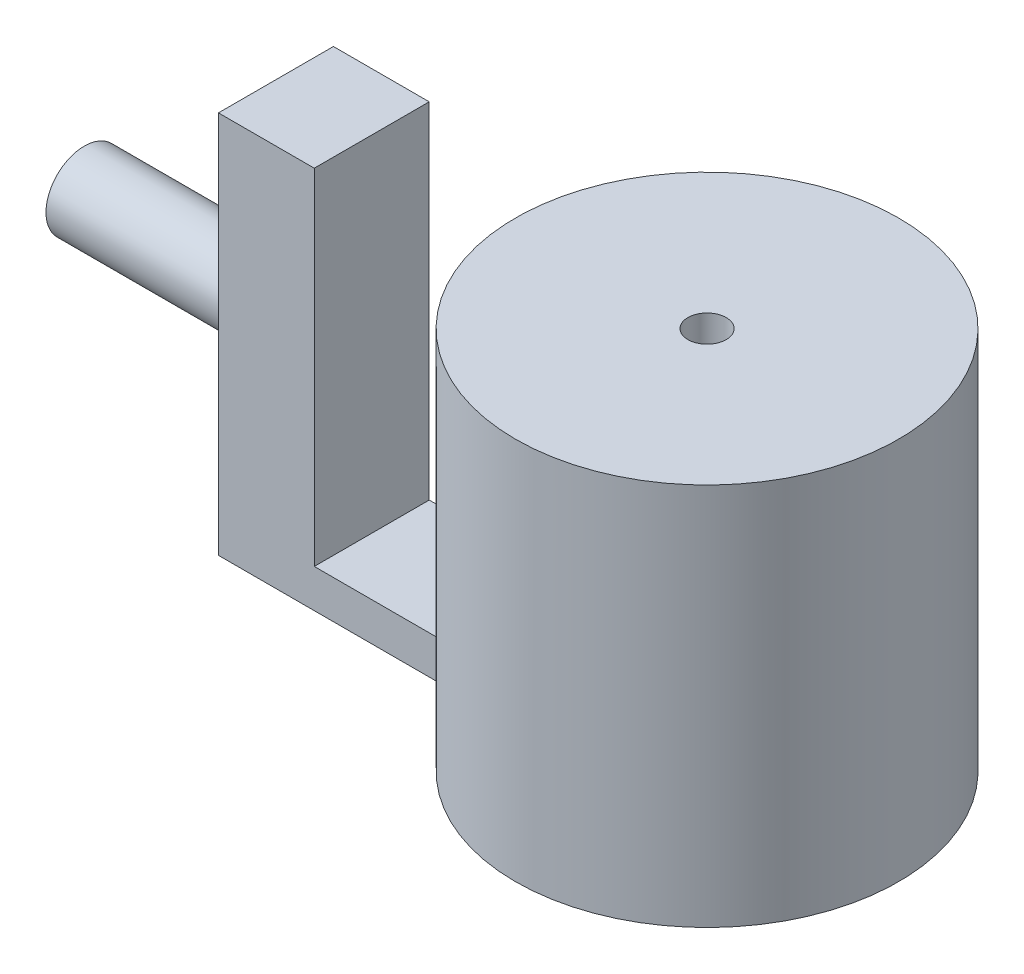
ISO-10303-21;
HEADER;
FILE_DESCRIPTION(('STEP AP214'),'2;1');
FILE_NAME('part.step','',(''),(''),'','','');
FILE_SCHEMA(('AUTOMOTIVE_DESIGN { 1 0 10303 214 1 1 1 1 }'));
ENDSEC;
DATA;
#1=APPLICATION_CONTEXT('core data for automotive mechanical design processes');
#2=APPLICATION_PROTOCOL_DEFINITION('international standard','automotive_design',2000,#1);
#3=PRODUCT_CONTEXT('',#1,'mechanical');
#4=PRODUCT('Part','Part','',(#3));
#5=PRODUCT_RELATED_PRODUCT_CATEGORY('part','',(#4));
#6=PRODUCT_DEFINITION_FORMATION('','',#4);
#7=PRODUCT_DEFINITION_CONTEXT('part definition',#1,'design');
#8=PRODUCT_DEFINITION('design','',#6,#7);
#9=PRODUCT_DEFINITION_SHAPE('','',#8);
#10=(LENGTH_UNIT() NAMED_UNIT(*) SI_UNIT(.MILLI.,.METRE.));
#11=(NAMED_UNIT(*) PLANE_ANGLE_UNIT() SI_UNIT($,.RADIAN.));
#12=(NAMED_UNIT(*) SI_UNIT($,.STERADIAN.) SOLID_ANGLE_UNIT());
#13=UNCERTAINTY_MEASURE_WITH_UNIT(LENGTH_MEASURE(1.E-05),#10,'distance_accuracy_value','');
#14=(GEOMETRIC_REPRESENTATION_CONTEXT(3) GLOBAL_UNCERTAINTY_ASSIGNED_CONTEXT((#13)) GLOBAL_UNIT_ASSIGNED_CONTEXT((#10,
#11,#12)) REPRESENTATION_CONTEXT('',''));
#15=CARTESIAN_POINT('',(0.,0.,0.));
#16=DIRECTION('',(0.,0.,1.));
#17=DIRECTION('',(1.,0.,0.));
#18=AXIS2_PLACEMENT_3D('',#15,#16,#17);
#19=CARTESIAN_POINT('',(0.,100.,0.));
#20=DIRECTION('',(0.,1.,0.));
#21=DIRECTION('',(0.,0.,1.));
#22=AXIS2_PLACEMENT_3D('',#19,#20,#21);
#23=PLANE('',#22);
#24=CARTESIAN_POINT('',(0.,100.,0.));
#25=DIRECTION('',(0.,1.,0.));
#26=DIRECTION('',(0.,0.,1.));
#27=AXIS2_PLACEMENT_3D('',#24,#25,#26);
#28=CIRCLE('',#27,50.);
#29=CARTESIAN_POINT('',(0.,100.,50.));
#30=VERTEX_POINT('',#29);
#31=EDGE_CURVE('E178',#30,#30,#28,.T.);
#32=ORIENTED_EDGE('',*,*,#31,.T.);
#33=EDGE_LOOP('',(#32));
#34=FACE_BOUND('',#33,.T.);
#35=CARTESIAN_POINT('',(0.,100.,0.));
#36=DIRECTION('',(0.,1.,0.));
#37=DIRECTION('',(0.,0.,1.));
#38=AXIS2_PLACEMENT_3D('',#35,#36,#37);
#39=CIRCLE('',#38,5.);
#40=CARTESIAN_POINT('',(0.,100.,5.));
#41=VERTEX_POINT('',#40);
#42=EDGE_CURVE('E170',#41,#41,#39,.T.);
#43=ORIENTED_EDGE('',*,*,#42,.F.);
#44=EDGE_LOOP('',(#43));
#45=FACE_BOUND('',#44,.T.);
#46=ADVANCED_FACE('F45',(#34,#45),#23,.T.);
#47=CARTESIAN_POINT('',(0.,0.,0.));
#48=DIRECTION('',(0.,1.,0.));
#49=DIRECTION('',(0.,0.,1.));
#50=AXIS2_PLACEMENT_3D('',#47,#48,#49);
#51=PLANE('',#50);
#52=DIRECTION('',(-1.,0.,0.));
#53=VECTOR('',#52,1.);
#54=CARTESIAN_POINT('',(-47.6969600708473,0.,15.));
#55=LINE('',#54,#53);
#56=CARTESIAN_POINT('',(-47.6969600708473,0.,15.));
#57=VERTEX_POINT('',#56);
#58=CARTESIAN_POINT('',(-112.5,0.,15.));
#59=VERTEX_POINT('',#58);
#60=EDGE_CURVE('E152',#57,#59,#55,.T.);
#61=ORIENTED_EDGE('',*,*,#60,.T.);
#62=DIRECTION('',(0.,0.,-1.));
#63=VECTOR('',#62,1.);
#64=CARTESIAN_POINT('',(-112.5,0.,15.));
#65=LINE('',#64,#63);
#66=CARTESIAN_POINT('',(-112.5,0.,-15.));
#67=VERTEX_POINT('',#66);
#68=EDGE_CURVE('E120',#59,#67,#65,.T.);
#69=ORIENTED_EDGE('',*,*,#68,.T.);
#70=DIRECTION('',(1.,0.,0.));
#71=VECTOR('',#70,1.);
#72=CARTESIAN_POINT('',(-47.6969600708473,0.,-15.));
#73=LINE('',#72,#71);
#74=CARTESIAN_POINT('',(-47.6969600708473,0.,-15.));
#75=VERTEX_POINT('',#74);
#76=EDGE_CURVE('E148',#67,#75,#73,.T.);
#77=ORIENTED_EDGE('',*,*,#76,.T.);
#78=CARTESIAN_POINT('',(0.,0.,0.));
#79=DIRECTION('',(0.,1.,0.));
#80=DIRECTION('',(0.,0.,1.));
#81=AXIS2_PLACEMENT_3D('',#78,#79,#80);
#82=CIRCLE('',#81,50.);
#83=EDGE_CURVE('E174',#57,#75,#82,.T.);
#84=ORIENTED_EDGE('',*,*,#83,.F.);
#85=EDGE_LOOP('',(#61,#69,#77,#84));
#86=FACE_BOUND('',#85,.T.);
#87=CARTESIAN_POINT('',(0.,0.,0.));
#88=DIRECTION('',(0.,1.,0.));
#89=DIRECTION('',(0.,0.,1.));
#90=AXIS2_PLACEMENT_3D('',#87,#88,#89);
#91=CIRCLE('',#90,5.);
#92=CARTESIAN_POINT('',(0.,0.,5.));
#93=VERTEX_POINT('',#92);
#94=EDGE_CURVE('E166',#93,#93,#91,.T.);
#95=ORIENTED_EDGE('',*,*,#94,.T.);
#96=EDGE_LOOP('',(#95));
#97=FACE_BOUND('',#96,.T.);
#98=ADVANCED_FACE('F191',(#86,#97),#51,.F.);
#99=CARTESIAN_POINT('',(0.,100.,0.));
#100=DIRECTION('',(0.,-1.,0.));
#101=DIRECTION('',(0.,0.,-1.));
#102=AXIS2_PLACEMENT_3D('',#99,#100,#101);
#103=CYLINDRICAL_SURFACE('',#102,50.);
#104=ORIENTED_EDGE('',*,*,#31,.F.);
#105=EDGE_LOOP('',(#104));
#106=FACE_BOUND('',#105,.T.);
#107=CARTESIAN_POINT('',(0.,10.,0.));
#108=DIRECTION('',(0.,1.,0.));
#109=DIRECTION('',(0.,0.,1.));
#110=AXIS2_PLACEMENT_3D('',#107,#108,#109);
#111=CIRCLE('',#110,50.);
#112=CARTESIAN_POINT('',(-47.6969600708473,9.99999999999999,-15.));
#113=VERTEX_POINT('',#112);
#114=CARTESIAN_POINT('',(-47.6969600708473,9.99999999999999,15.));
#115=VERTEX_POINT('',#114);
#116=EDGE_CURVE('E69',#113,#115,#111,.T.);
#117=ORIENTED_EDGE('',*,*,#116,.T.);
#118=DIRECTION('',(0.,-1.,0.));
#119=VECTOR('',#118,1.);
#120=CARTESIAN_POINT('',(-47.6969600708473,10.,15.));
#121=LINE('',#120,#119);
#122=EDGE_CURVE('E163',#115,#57,#121,.T.);
#123=ORIENTED_EDGE('',*,*,#122,.T.);
#124=ORIENTED_EDGE('',*,*,#83,.T.);
#125=DIRECTION('',(0.,-1.,0.));
#126=VECTOR('',#125,1.);
#127=CARTESIAN_POINT('',(-47.6969600708473,10.,-15.));
#128=LINE('',#127,#126);
#129=EDGE_CURVE('E158',#113,#75,#128,.T.);
#130=ORIENTED_EDGE('',*,*,#129,.F.);
#131=EDGE_LOOP('',(#117,#123,#124,#130));
#132=FACE_BOUND('',#131,.T.);
#133=ADVANCED_FACE('F47',(#106,#132),#103,.T.);
#134=CARTESIAN_POINT('',(0.,100.,0.));
#135=DIRECTION('',(0.,-1.,0.));
#136=DIRECTION('',(0.,0.,-1.));
#137=AXIS2_PLACEMENT_3D('',#134,#135,#136);
#138=CYLINDRICAL_SURFACE('',#137,5.);
#139=ORIENTED_EDGE('',*,*,#42,.T.);
#140=EDGE_LOOP('',(#139));
#141=FACE_BOUND('',#140,.T.);
#142=ORIENTED_EDGE('',*,*,#94,.F.);
#143=EDGE_LOOP('',(#142));
#144=FACE_BOUND('',#143,.T.);
#145=ADVANCED_FACE('F196',(#141,#144),#138,.F.);
#146=CARTESIAN_POINT('',(-47.6969600708473,10.,15.));
#147=DIRECTION('',(0.,0.,1.));
#148=DIRECTION('',(1.,0.,0.));
#149=AXIS2_PLACEMENT_3D('',#146,#147,#148);
#150=PLANE('',#149);
#151=DIRECTION('',(0.,-1.,0.));
#152=VECTOR('',#151,1.);
#153=CARTESIAN_POINT('',(-112.5,139.051248379533,15.));
#154=LINE('',#153,#152);
#155=CARTESIAN_POINT('',(-112.5,100.,15.));
#156=VERTEX_POINT('',#155);
#157=EDGE_CURVE('E114',#156,#59,#154,.T.);
#158=ORIENTED_EDGE('',*,*,#157,.T.);
#159=ORIENTED_EDGE('',*,*,#60,.F.);
#160=ORIENTED_EDGE('',*,*,#122,.F.);
#161=DIRECTION('',(-1.,0.,0.));
#162=VECTOR('',#161,1.);
#163=CARTESIAN_POINT('',(-47.6969600708473,10.,15.));
#164=LINE('',#163,#162);
#165=CARTESIAN_POINT('',(-87.5,10.,15.));
#166=VERTEX_POINT('',#165);
#167=EDGE_CURVE('E155',#115,#166,#164,.T.);
#168=ORIENTED_EDGE('',*,*,#167,.T.);
#169=DIRECTION('',(0.,-1.,0.));
#170=VECTOR('',#169,1.);
#171=CARTESIAN_POINT('',(-87.5,139.051248379533,15.));
#172=LINE('',#171,#170);
#173=CARTESIAN_POINT('',(-87.5,100.,15.));
#174=VERTEX_POINT('',#173);
#175=EDGE_CURVE('E128',#174,#166,#172,.T.);
#176=ORIENTED_EDGE('',*,*,#175,.F.);
#177=DIRECTION('',(-1.,0.,0.));
#178=VECTOR('',#177,1.);
#179=CARTESIAN_POINT('',(-112.5,100.,15.));
#180=LINE('',#179,#178);
#181=EDGE_CURVE('E105',#174,#156,#180,.T.);
#182=ORIENTED_EDGE('',*,*,#181,.T.);
#183=EDGE_LOOP('',(#158,#159,#160,#168,#176,#182));
#184=FACE_BOUND('',#183,.T.);
#185=ADVANCED_FACE('F126',(#184),#150,.T.);
#186=CARTESIAN_POINT('',(-47.6969600708473,10.,-15.));
#187=DIRECTION('',(0.,0.,-1.));
#188=DIRECTION('',(-1.,0.,0.));
#189=AXIS2_PLACEMENT_3D('',#186,#187,#188);
#190=PLANE('',#189);
#191=ORIENTED_EDGE('',*,*,#76,.F.);
#192=DIRECTION('',(0.,-1.,0.));
#193=VECTOR('',#192,1.);
#194=CARTESIAN_POINT('',(-112.5,139.051248379533,-15.));
#195=LINE('',#194,#193);
#196=CARTESIAN_POINT('',(-112.5,100.,-15.));
#197=VERTEX_POINT('',#196);
#198=EDGE_CURVE('E113',#197,#67,#195,.T.);
#199=ORIENTED_EDGE('',*,*,#198,.F.);
#200=DIRECTION('',(1.,0.,0.));
#201=VECTOR('',#200,1.);
#202=CARTESIAN_POINT('',(-112.5,100.,-15.));
#203=LINE('',#202,#201);
#204=CARTESIAN_POINT('',(-87.5,100.,-15.));
#205=VERTEX_POINT('',#204);
#206=EDGE_CURVE('E108',#197,#205,#203,.T.);
#207=ORIENTED_EDGE('',*,*,#206,.T.);
#208=DIRECTION('',(0.,-1.,0.));
#209=VECTOR('',#208,1.);
#210=CARTESIAN_POINT('',(-87.5,139.051248379533,-15.));
#211=LINE('',#210,#209);
#212=CARTESIAN_POINT('',(-87.5,10.,-15.));
#213=VERTEX_POINT('',#212);
#214=EDGE_CURVE('E138',#205,#213,#211,.T.);
#215=ORIENTED_EDGE('',*,*,#214,.T.);
#216=DIRECTION('',(1.,0.,0.));
#217=VECTOR('',#216,1.);
#218=CARTESIAN_POINT('',(-47.6969600708473,10.,-15.));
#219=LINE('',#218,#217);
#220=EDGE_CURVE('E149',#213,#113,#219,.T.);
#221=ORIENTED_EDGE('',*,*,#220,.T.);
#222=ORIENTED_EDGE('',*,*,#129,.T.);
#223=EDGE_LOOP('',(#191,#199,#207,#215,#221,#222));
#224=FACE_BOUND('',#223,.T.);
#225=ADVANCED_FACE('F185',(#224),#190,.T.);
#226=CARTESIAN_POINT('',(0.,10.,0.));
#227=DIRECTION('',(0.,1.,0.));
#228=DIRECTION('',(0.,0.,1.));
#229=AXIS2_PLACEMENT_3D('',#226,#227,#228);
#230=PLANE('',#229);
#231=DIRECTION('',(0.,0.,-1.));
#232=VECTOR('',#231,1.);
#233=CARTESIAN_POINT('',(-87.5,10.,0.));
#234=LINE('',#233,#232);
#235=EDGE_CURVE('E49',#166,#213,#234,.T.);
#236=ORIENTED_EDGE('',*,*,#235,.F.);
#237=ORIENTED_EDGE('',*,*,#167,.F.);
#238=ORIENTED_EDGE('',*,*,#116,.F.);
#239=ORIENTED_EDGE('',*,*,#220,.F.);
#240=EDGE_LOOP('',(#236,#237,#238,#239));
#241=FACE_BOUND('',#240,.T.);
#242=ADVANCED_FACE('F187',(#241),#230,.T.);
#243=CARTESIAN_POINT('',(0.,100.,0.));
#244=DIRECTION('',(0.,1.,0.));
#245=DIRECTION('',(0.,0.,1.));
#246=AXIS2_PLACEMENT_3D('',#243,#244,#245);
#247=PLANE('',#246);
#248=DIRECTION('',(0.,0.,1.));
#249=VECTOR('',#248,1.);
#250=CARTESIAN_POINT('',(-87.5,100.,15.));
#251=LINE('',#250,#249);
#252=EDGE_CURVE('E135',#205,#174,#251,.T.);
#253=ORIENTED_EDGE('',*,*,#252,.F.);
#254=ORIENTED_EDGE('',*,*,#206,.F.);
#255=DIRECTION('',(0.,0.,-1.));
#256=VECTOR('',#255,1.);
#257=CARTESIAN_POINT('',(-112.5,100.,15.));
#258=LINE('',#257,#256);
#259=EDGE_CURVE('E101',#156,#197,#258,.T.);
#260=ORIENTED_EDGE('',*,*,#259,.F.);
#261=ORIENTED_EDGE('',*,*,#181,.F.);
#262=EDGE_LOOP('',(#253,#254,#260,#261));
#263=FACE_BOUND('',#262,.T.);
#264=ADVANCED_FACE('F103',(#263),#247,.T.);
#265=CARTESIAN_POINT('',(-112.5,139.051248379533,15.));
#266=DIRECTION('',(-1.,0.,0.));
#267=DIRECTION('',(0.,0.,1.));
#268=AXIS2_PLACEMENT_3D('',#265,#266,#267);
#269=PLANE('',#268);
#270=CARTESIAN_POINT('',(-112.5,50.,0.));
#271=DIRECTION('',(-1.,0.,0.));
#272=DIRECTION('',(0.,0.,1.));
#273=AXIS2_PLACEMENT_3D('',#270,#271,#272);
#274=CIRCLE('',#273,10.);
#275=CARTESIAN_POINT('',(-112.5,50.,10.));
#276=VERTEX_POINT('',#275);
#277=EDGE_CURVE('E11',#276,#276,#274,.T.);
#278=ORIENTED_EDGE('',*,*,#277,.F.);
#279=EDGE_LOOP('',(#278));
#280=FACE_BOUND('',#279,.T.);
#281=ORIENTED_EDGE('',*,*,#157,.F.);
#282=ORIENTED_EDGE('',*,*,#259,.T.);
#283=ORIENTED_EDGE('',*,*,#198,.T.);
#284=ORIENTED_EDGE('',*,*,#68,.F.);
#285=EDGE_LOOP('',(#281,#282,#283,#284));
#286=FACE_BOUND('',#285,.T.);
#287=ADVANCED_FACE('F118',(#280,#286),#269,.T.);
#288=CARTESIAN_POINT('',(-87.5,139.051248379533,15.));
#289=DIRECTION('',(1.,0.,0.));
#290=DIRECTION('',(0.,0.,-1.));
#291=AXIS2_PLACEMENT_3D('',#288,#289,#290);
#292=PLANE('',#291);
#293=ORIENTED_EDGE('',*,*,#175,.T.);
#294=ORIENTED_EDGE('',*,*,#235,.T.);
#295=ORIENTED_EDGE('',*,*,#214,.F.);
#296=ORIENTED_EDGE('',*,*,#252,.T.);
#297=EDGE_LOOP('',(#293,#294,#295,#296));
#298=FACE_BOUND('',#297,.T.);
#299=ADVANCED_FACE('F189',(#298),#292,.T.);
#300=CARTESIAN_POINT('',(-162.5,50.,0.));
#301=DIRECTION('',(1.,0.,0.));
#302=DIRECTION('',(0.,0.,-1.));
#303=AXIS2_PLACEMENT_3D('',#300,#301,#302);
#304=CYLINDRICAL_SURFACE('',#303,10.);
#305=CARTESIAN_POINT('',(-162.5,50.,0.));
#306=DIRECTION('',(-1.,0.,0.));
#307=DIRECTION('',(0.,0.,1.));
#308=AXIS2_PLACEMENT_3D('',#305,#306,#307);
#309=CIRCLE('',#308,10.);
#310=CARTESIAN_POINT('',(-162.5,50.,10.));
#311=VERTEX_POINT('',#310);
#312=EDGE_CURVE('E132',#311,#311,#309,.T.);
#313=ORIENTED_EDGE('',*,*,#312,.F.);
#314=EDGE_LOOP('',(#313));
#315=FACE_BOUND('',#314,.T.);
#316=ORIENTED_EDGE('',*,*,#277,.T.);
#317=EDGE_LOOP('',(#316));
#318=FACE_BOUND('',#317,.T.);
#319=ADVANCED_FACE('F278',(#315,#318),#304,.T.);
#320=CARTESIAN_POINT('',(-162.5,50.,0.));
#321=DIRECTION('',(-1.,0.,0.));
#322=DIRECTION('',(0.,0.,1.));
#323=AXIS2_PLACEMENT_3D('',#320,#321,#322);
#324=PLANE('',#323);
#325=ORIENTED_EDGE('',*,*,#312,.T.);
#326=EDGE_LOOP('',(#325));
#327=FACE_BOUND('',#326,.T.);
#328=ADVANCED_FACE('F286',(#327),#324,.T.);
#329=CLOSED_SHELL('',(#46,#98,#133,#145,#185,#225,#242,#264,#287,#299,#319,#328));
#330=MANIFOLD_SOLID_BREP('B2',#329);
#331=ADVANCED_BREP_SHAPE_REPRESENTATION('',(#18,#330),#14);
#332=SHAPE_DEFINITION_REPRESENTATION(#9,#331);
ENDSEC;
END-ISO-10303-21;
